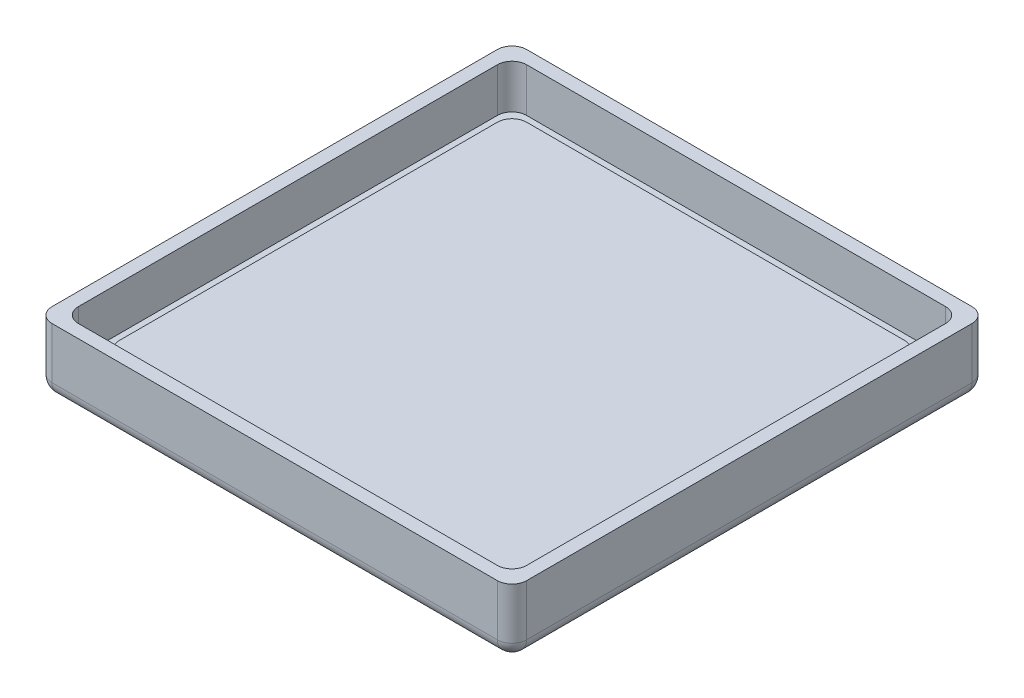
ISO-10303-21;
HEADER;
FILE_DESCRIPTION(('STEP AP214'),'2;1');
FILE_NAME('part.step','',(''),(''),'','','');
FILE_SCHEMA(('AUTOMOTIVE_DESIGN { 1 0 10303 214 1 1 1 1 }'));
ENDSEC;
DATA;
#1=APPLICATION_CONTEXT('core data for automotive mechanical design processes');
#2=APPLICATION_PROTOCOL_DEFINITION('international standard','automotive_design',2000,#1);
#3=PRODUCT_CONTEXT('',#1,'mechanical');
#4=PRODUCT('Part','Part','',(#3));
#5=PRODUCT_RELATED_PRODUCT_CATEGORY('part','',(#4));
#6=PRODUCT_DEFINITION_FORMATION('','',#4);
#7=PRODUCT_DEFINITION_CONTEXT('part definition',#1,'design');
#8=PRODUCT_DEFINITION('design','',#6,#7);
#9=PRODUCT_DEFINITION_SHAPE('','',#8);
#10=(LENGTH_UNIT() NAMED_UNIT(*) SI_UNIT(.MILLI.,.METRE.));
#11=(NAMED_UNIT(*) PLANE_ANGLE_UNIT() SI_UNIT($,.RADIAN.));
#12=(NAMED_UNIT(*) SI_UNIT($,.STERADIAN.) SOLID_ANGLE_UNIT());
#13=UNCERTAINTY_MEASURE_WITH_UNIT(LENGTH_MEASURE(1.E-05),#10,'distance_accuracy_value','');
#14=(GEOMETRIC_REPRESENTATION_CONTEXT(3) GLOBAL_UNCERTAINTY_ASSIGNED_CONTEXT((#13)) GLOBAL_UNIT_ASSIGNED_CONTEXT((#10,
#11,#12)) REPRESENTATION_CONTEXT('',''));
#15=CARTESIAN_POINT('',(0.,0.,0.));
#16=DIRECTION('',(0.,0.,1.));
#17=DIRECTION('',(1.,0.,0.));
#18=AXIS2_PLACEMENT_3D('',#15,#16,#17);
#19=CARTESIAN_POINT('',(0.,7.5,0.));
#20=DIRECTION('',(0.,1.,0.));
#21=DIRECTION('',(0.,0.,1.));
#22=AXIS2_PLACEMENT_3D('',#19,#20,#21);
#23=PLANE('',#22);
#24=CARTESIAN_POINT('',(9.5,7.5,-152.5));
#25=DIRECTION('',(0.,1.,0.));
#26=DIRECTION('',(0.,0.,1.));
#27=AXIS2_PLACEMENT_3D('',#24,#25,#26);
#28=CIRCLE('',#27,5.);
#29=CARTESIAN_POINT('',(9.5,7.5,-157.5));
#30=VERTEX_POINT('',#29);
#31=CARTESIAN_POINT('',(4.5,7.5,-152.5));
#32=VERTEX_POINT('',#31);
#33=EDGE_CURVE('E307',#30,#32,#28,.T.);
#34=ORIENTED_EDGE('',*,*,#33,.T.);
#35=DIRECTION('',(0.,0.,1.));
#36=VECTOR('',#35,1.);
#37=CARTESIAN_POINT('',(4.50000000000002,7.5,0.));
#38=LINE('',#37,#36);
#39=CARTESIAN_POINT('',(4.50000000000002,7.5,-9.50000000000004));
#40=VERTEX_POINT('',#39);
#41=EDGE_CURVE('E325',#32,#40,#38,.T.);
#42=ORIENTED_EDGE('',*,*,#41,.T.);
#43=CARTESIAN_POINT('',(9.50000000000002,7.5,-9.5));
#44=DIRECTION('',(0.,1.,0.));
#45=DIRECTION('',(0.,0.,1.));
#46=AXIS2_PLACEMENT_3D('',#43,#44,#45);
#47=CIRCLE('',#46,5.);
#48=CARTESIAN_POINT('',(9.50000000000002,7.5,-4.5));
#49=VERTEX_POINT('',#48);
#50=EDGE_CURVE('E327',#40,#49,#47,.T.);
#51=ORIENTED_EDGE('',*,*,#50,.T.);
#52=DIRECTION('',(1.,0.,0.));
#53=VECTOR('',#52,1.);
#54=CARTESIAN_POINT('',(0.,7.5,-4.5));
#55=LINE('',#54,#53);
#56=CARTESIAN_POINT('',(152.5,7.5,-4.5));
#57=VERTEX_POINT('',#56);
#58=EDGE_CURVE('E376',#49,#57,#55,.T.);
#59=ORIENTED_EDGE('',*,*,#58,.T.);
#60=CARTESIAN_POINT('',(152.5,7.5,-9.5));
#61=DIRECTION('',(0.,1.,0.));
#62=DIRECTION('',(0.,0.,1.));
#63=AXIS2_PLACEMENT_3D('',#60,#61,#62);
#64=CIRCLE('',#63,4.99999999999999);
#65=CARTESIAN_POINT('',(157.5,7.5,-9.5));
#66=VERTEX_POINT('',#65);
#67=EDGE_CURVE('E374',#57,#66,#64,.T.);
#68=ORIENTED_EDGE('',*,*,#67,.T.);
#69=DIRECTION('',(0.,0.,1.));
#70=VECTOR('',#69,1.);
#71=CARTESIAN_POINT('',(157.5,7.5,0.));
#72=LINE('',#71,#70);
#73=CARTESIAN_POINT('',(157.5,7.5,-152.5));
#74=VERTEX_POINT('',#73);
#75=EDGE_CURVE('E371',#74,#66,#72,.T.);
#76=ORIENTED_EDGE('',*,*,#75,.F.);
#77=CARTESIAN_POINT('',(152.5,7.5,-152.5));
#78=DIRECTION('',(0.,1.,0.));
#79=DIRECTION('',(0.,0.,1.));
#80=AXIS2_PLACEMENT_3D('',#77,#78,#79);
#81=CIRCLE('',#80,5.);
#82=CARTESIAN_POINT('',(152.5,7.5,-157.5));
#83=VERTEX_POINT('',#82);
#84=EDGE_CURVE('E150',#83,#74,#81,.F.);
#85=ORIENTED_EDGE('',*,*,#84,.F.);
#86=DIRECTION('',(1.,0.,0.));
#87=VECTOR('',#86,1.);
#88=CARTESIAN_POINT('',(0.,7.5,-157.5));
#89=LINE('',#88,#87);
#90=EDGE_CURVE('E145',#30,#83,#89,.T.);
#91=ORIENTED_EDGE('',*,*,#90,.F.);
#92=EDGE_LOOP('',(#34,#42,#51,#59,#68,#76,#85,#91));
#93=FACE_BOUND('',#92,.T.);
#94=DIRECTION('',(0.,0.,1.));
#95=VECTOR('',#94,1.);
#96=CARTESIAN_POINT('',(11.5,7.5,-150.5));
#97=LINE('',#96,#95);
#98=CARTESIAN_POINT('',(11.5,7.5,-145.5));
#99=VERTEX_POINT('',#98);
#100=CARTESIAN_POINT('',(11.5,7.5,-16.5));
#101=VERTEX_POINT('',#100);
#102=EDGE_CURVE('E410',#99,#101,#97,.T.);
#103=ORIENTED_EDGE('',*,*,#102,.F.);
#104=CARTESIAN_POINT('',(16.5,7.5,-145.5));
#105=DIRECTION('',(0.,1.,0.));
#106=DIRECTION('',(0.,0.,1.));
#107=AXIS2_PLACEMENT_3D('',#104,#105,#106);
#108=CIRCLE('',#107,5.);
#109=CARTESIAN_POINT('',(16.5,7.5,-150.5));
#110=VERTEX_POINT('',#109);
#111=EDGE_CURVE('E137',#99,#110,#108,.F.);
#112=ORIENTED_EDGE('',*,*,#111,.T.);
#113=DIRECTION('',(-1.,0.,0.));
#114=VECTOR('',#113,1.);
#115=CARTESIAN_POINT('',(11.5,7.5,-150.5));
#116=LINE('',#115,#114);
#117=CARTESIAN_POINT('',(145.5,7.5,-150.5));
#118=VERTEX_POINT('',#117);
#119=EDGE_CURVE('E400',#118,#110,#116,.T.);
#120=ORIENTED_EDGE('',*,*,#119,.F.);
#121=CARTESIAN_POINT('',(145.5,7.5,-145.5));
#122=DIRECTION('',(0.,1.,0.));
#123=DIRECTION('',(0.,0.,1.));
#124=AXIS2_PLACEMENT_3D('',#121,#122,#123);
#125=CIRCLE('',#124,5.);
#126=CARTESIAN_POINT('',(150.5,7.5,-145.5));
#127=VERTEX_POINT('',#126);
#128=EDGE_CURVE('E482',#118,#127,#125,.F.);
#129=ORIENTED_EDGE('',*,*,#128,.T.);
#130=DIRECTION('',(0.,0.,-1.));
#131=VECTOR('',#130,1.);
#132=CARTESIAN_POINT('',(150.5,7.5,-150.5));
#133=LINE('',#132,#131);
#134=CARTESIAN_POINT('',(150.5,7.5,-16.5));
#135=VERTEX_POINT('',#134);
#136=EDGE_CURVE('E416',#135,#127,#133,.T.);
#137=ORIENTED_EDGE('',*,*,#136,.F.);
#138=CARTESIAN_POINT('',(145.5,7.5,-16.5));
#139=DIRECTION('',(0.,1.,0.));
#140=DIRECTION('',(0.,0.,1.));
#141=AXIS2_PLACEMENT_3D('',#138,#139,#140);
#142=CIRCLE('',#141,5.);
#143=CARTESIAN_POINT('',(145.5,7.5,-11.5));
#144=VERTEX_POINT('',#143);
#145=EDGE_CURVE('E484',#135,#144,#142,.F.);
#146=ORIENTED_EDGE('',*,*,#145,.T.);
#147=DIRECTION('',(1.,0.,0.));
#148=VECTOR('',#147,1.);
#149=CARTESIAN_POINT('',(11.5,7.5,-11.5));
#150=LINE('',#149,#148);
#151=CARTESIAN_POINT('',(16.5,7.5,-11.5));
#152=VERTEX_POINT('',#151);
#153=EDGE_CURVE('E413',#152,#144,#150,.T.);
#154=ORIENTED_EDGE('',*,*,#153,.F.);
#155=CARTESIAN_POINT('',(16.5,7.5,-16.5));
#156=DIRECTION('',(0.,1.,0.));
#157=DIRECTION('',(0.,0.,1.));
#158=AXIS2_PLACEMENT_3D('',#155,#156,#157);
#159=CIRCLE('',#158,5.);
#160=EDGE_CURVE('E12',#152,#101,#159,.F.);
#161=ORIENTED_EDGE('',*,*,#160,.T.);
#162=EDGE_LOOP('',(#103,#112,#120,#129,#137,#146,#154,#161));
#163=FACE_BOUND('',#162,.T.);
#164=ADVANCED_FACE('F128',(#93,#163),#23,.T.);
#165=CARTESIAN_POINT('',(11.5,12.5,-150.5));
#166=DIRECTION('',(1.,0.,0.));
#167=DIRECTION('',(0.,0.,-1.));
#168=AXIS2_PLACEMENT_3D('',#165,#166,#167);
#169=PLANE('',#168);
#170=DIRECTION('',(0.,0.,1.));
#171=VECTOR('',#170,1.);
#172=CARTESIAN_POINT('',(11.5,12.5,-150.5));
#173=LINE('',#172,#171);
#174=CARTESIAN_POINT('',(11.5,12.5,-145.5));
#175=VERTEX_POINT('',#174);
#176=CARTESIAN_POINT('',(11.5,12.5,-16.5));
#177=VERTEX_POINT('',#176);
#178=EDGE_CURVE('E396',#175,#177,#173,.T.);
#179=ORIENTED_EDGE('',*,*,#178,.F.);
#180=DIRECTION('',(0.,-1.,0.));
#181=VECTOR('',#180,1.);
#182=CARTESIAN_POINT('',(11.5,12.5,-145.5));
#183=LINE('',#182,#181);
#184=EDGE_CURVE('E479',#175,#99,#183,.T.);
#185=ORIENTED_EDGE('',*,*,#184,.T.);
#186=ORIENTED_EDGE('',*,*,#102,.T.);
#187=DIRECTION('',(0.,-1.,0.));
#188=VECTOR('',#187,1.);
#189=CARTESIAN_POINT('',(11.5,12.5,-16.5));
#190=LINE('',#189,#188);
#191=EDGE_CURVE('E477',#101,#177,#190,.F.);
#192=ORIENTED_EDGE('',*,*,#191,.T.);
#193=EDGE_LOOP('',(#179,#185,#186,#192));
#194=FACE_BOUND('',#193,.T.);
#195=ADVANCED_FACE('F585',(#194),#169,.F.);
#196=CARTESIAN_POINT('',(11.5,12.5,-11.5));
#197=DIRECTION('',(0.,0.,-1.));
#198=DIRECTION('',(-1.,0.,0.));
#199=AXIS2_PLACEMENT_3D('',#196,#197,#198);
#200=PLANE('',#199);
#201=ORIENTED_EDGE('',*,*,#153,.T.);
#202=DIRECTION('',(0.,-1.,0.));
#203=VECTOR('',#202,1.);
#204=CARTESIAN_POINT('',(145.5,12.5,-11.5));
#205=LINE('',#204,#203);
#206=CARTESIAN_POINT('',(145.5,12.5,-11.5));
#207=VERTEX_POINT('',#206);
#208=EDGE_CURVE('E441',#144,#207,#205,.F.);
#209=ORIENTED_EDGE('',*,*,#208,.T.);
#210=DIRECTION('',(1.,0.,0.));
#211=VECTOR('',#210,1.);
#212=CARTESIAN_POINT('',(11.5,12.5,-11.5));
#213=LINE('',#212,#211);
#214=CARTESIAN_POINT('',(16.5,12.5,-11.5));
#215=VERTEX_POINT('',#214);
#216=EDGE_CURVE('E399',#215,#207,#213,.T.);
#217=ORIENTED_EDGE('',*,*,#216,.F.);
#218=DIRECTION('',(0.,-1.,0.));
#219=VECTOR('',#218,1.);
#220=CARTESIAN_POINT('',(16.5,12.5,-11.5));
#221=LINE('',#220,#219);
#222=EDGE_CURVE('E438',#215,#152,#221,.T.);
#223=ORIENTED_EDGE('',*,*,#222,.T.);
#224=EDGE_LOOP('',(#201,#209,#217,#223));
#225=FACE_BOUND('',#224,.T.);
#226=ADVANCED_FACE('F590',(#225),#200,.F.);
#227=CARTESIAN_POINT('',(150.5,12.5,-150.5));
#228=DIRECTION('',(-1.,0.,0.));
#229=DIRECTION('',(0.,0.,1.));
#230=AXIS2_PLACEMENT_3D('',#227,#228,#229);
#231=PLANE('',#230);
#232=ORIENTED_EDGE('',*,*,#136,.T.);
#233=DIRECTION('',(0.,-1.,0.));
#234=VECTOR('',#233,1.);
#235=CARTESIAN_POINT('',(150.5,12.5,-145.5));
#236=LINE('',#235,#234);
#237=CARTESIAN_POINT('',(150.5,12.5,-145.5));
#238=VERTEX_POINT('',#237);
#239=EDGE_CURVE('E428',#127,#238,#236,.F.);
#240=ORIENTED_EDGE('',*,*,#239,.T.);
#241=DIRECTION('',(0.,0.,-1.));
#242=VECTOR('',#241,1.);
#243=CARTESIAN_POINT('',(150.5,12.5,-150.5));
#244=LINE('',#243,#242);
#245=CARTESIAN_POINT('',(150.5,12.5,-16.5));
#246=VERTEX_POINT('',#245);
#247=EDGE_CURVE('E403',#246,#238,#244,.T.);
#248=ORIENTED_EDGE('',*,*,#247,.F.);
#249=DIRECTION('',(0.,-1.,0.));
#250=VECTOR('',#249,1.);
#251=CARTESIAN_POINT('',(150.5,12.5,-16.5));
#252=LINE('',#251,#250);
#253=EDGE_CURVE('E425',#246,#135,#252,.T.);
#254=ORIENTED_EDGE('',*,*,#253,.T.);
#255=EDGE_LOOP('',(#232,#240,#248,#254));
#256=FACE_BOUND('',#255,.T.);
#257=ADVANCED_FACE('F886',(#256),#231,.F.);
#258=CARTESIAN_POINT('',(11.5,12.5,-150.5));
#259=DIRECTION('',(0.,0.,1.));
#260=DIRECTION('',(1.,0.,0.));
#261=AXIS2_PLACEMENT_3D('',#258,#259,#260);
#262=PLANE('',#261);
#263=DIRECTION('',(-1.,0.,0.));
#264=VECTOR('',#263,1.);
#265=CARTESIAN_POINT('',(11.5,12.5,-150.5));
#266=LINE('',#265,#264);
#267=CARTESIAN_POINT('',(145.5,12.5,-150.5));
#268=VERTEX_POINT('',#267);
#269=CARTESIAN_POINT('',(16.5,12.5,-150.5));
#270=VERTEX_POINT('',#269);
#271=EDGE_CURVE('E406',#268,#270,#266,.T.);
#272=ORIENTED_EDGE('',*,*,#271,.F.);
#273=DIRECTION('',(0.,-1.,0.));
#274=VECTOR('',#273,1.);
#275=CARTESIAN_POINT('',(145.5,12.5,-150.5));
#276=LINE('',#275,#274);
#277=EDGE_CURVE('E422',#268,#118,#276,.T.);
#278=ORIENTED_EDGE('',*,*,#277,.T.);
#279=ORIENTED_EDGE('',*,*,#119,.T.);
#280=DIRECTION('',(0.,-1.,0.));
#281=VECTOR('',#280,1.);
#282=CARTESIAN_POINT('',(16.5,12.5,-150.5));
#283=LINE('',#282,#281);
#284=EDGE_CURVE('E409',#110,#270,#283,.F.);
#285=ORIENTED_EDGE('',*,*,#284,.T.);
#286=EDGE_LOOP('',(#272,#278,#279,#285));
#287=FACE_BOUND('',#286,.T.);
#288=ADVANCED_FACE('F875',(#287),#262,.F.);
#289=CARTESIAN_POINT('',(0.,12.5,0.));
#290=DIRECTION('',(0.,1.,0.));
#291=DIRECTION('',(0.,0.,1.));
#292=AXIS2_PLACEMENT_3D('',#289,#290,#291);
#293=PLANE('',#292);
#294=ORIENTED_EDGE('',*,*,#247,.T.);
#295=CARTESIAN_POINT('',(145.5,12.5,-145.5));
#296=DIRECTION('',(0.,1.,0.));
#297=DIRECTION('',(0.,0.,1.));
#298=AXIS2_PLACEMENT_3D('',#295,#296,#297);
#299=CIRCLE('',#298,5.);
#300=EDGE_CURVE('E436',#238,#268,#299,.T.);
#301=ORIENTED_EDGE('',*,*,#300,.T.);
#302=ORIENTED_EDGE('',*,*,#271,.T.);
#303=CARTESIAN_POINT('',(16.5,12.5,-145.5));
#304=DIRECTION('',(0.,1.,0.));
#305=DIRECTION('',(0.,0.,1.));
#306=AXIS2_PLACEMENT_3D('',#303,#304,#305);
#307=CIRCLE('',#306,5.);
#308=EDGE_CURVE('E432',#270,#175,#307,.T.);
#309=ORIENTED_EDGE('',*,*,#308,.T.);
#310=ORIENTED_EDGE('',*,*,#178,.T.);
#311=CARTESIAN_POINT('',(16.5,12.5,-16.5));
#312=DIRECTION('',(0.,1.,0.));
#313=DIRECTION('',(0.,0.,1.));
#314=AXIS2_PLACEMENT_3D('',#311,#312,#313);
#315=CIRCLE('',#314,5.);
#316=EDGE_CURVE('E430',#177,#215,#315,.T.);
#317=ORIENTED_EDGE('',*,*,#316,.T.);
#318=ORIENTED_EDGE('',*,*,#216,.T.);
#319=CARTESIAN_POINT('',(145.5,12.5,-16.5));
#320=DIRECTION('',(0.,1.,0.));
#321=DIRECTION('',(0.,0.,1.));
#322=AXIS2_PLACEMENT_3D('',#319,#320,#321);
#323=CIRCLE('',#322,5.);
#324=EDGE_CURVE('E434',#207,#246,#323,.T.);
#325=ORIENTED_EDGE('',*,*,#324,.T.);
#326=EDGE_LOOP('',(#294,#301,#302,#309,#310,#317,#318,#325));
#327=FACE_BOUND('',#326,.T.);
#328=ADVANCED_FACE('F865',(#327),#293,.T.);
#329=CARTESIAN_POINT('',(145.5,12.5,-145.5));
#330=DIRECTION('',(0.,-1.,0.));
#331=DIRECTION('',(0.,0.,-1.));
#332=AXIS2_PLACEMENT_3D('',#329,#330,#331);
#333=CYLINDRICAL_SURFACE('',#332,5.);
#334=ORIENTED_EDGE('',*,*,#300,.F.);
#335=ORIENTED_EDGE('',*,*,#239,.F.);
#336=ORIENTED_EDGE('',*,*,#128,.F.);
#337=ORIENTED_EDGE('',*,*,#277,.F.);
#338=EDGE_LOOP('',(#334,#335,#336,#337));
#339=FACE_BOUND('',#338,.T.);
#340=ADVANCED_FACE('F854',(#339),#333,.T.);
#341=CARTESIAN_POINT('',(145.5,12.5,-16.5));
#342=DIRECTION('',(0.,-1.,0.));
#343=DIRECTION('',(0.,0.,-1.));
#344=AXIS2_PLACEMENT_3D('',#341,#342,#343);
#345=CYLINDRICAL_SURFACE('',#344,5.);
#346=ORIENTED_EDGE('',*,*,#324,.F.);
#347=ORIENTED_EDGE('',*,*,#208,.F.);
#348=ORIENTED_EDGE('',*,*,#145,.F.);
#349=ORIENTED_EDGE('',*,*,#253,.F.);
#350=EDGE_LOOP('',(#346,#347,#348,#349));
#351=FACE_BOUND('',#350,.T.);
#352=ADVANCED_FACE('F767',(#351),#345,.T.);
#353=CARTESIAN_POINT('',(16.5,12.5,-145.5));
#354=DIRECTION('',(0.,-1.,0.));
#355=DIRECTION('',(0.,0.,-1.));
#356=AXIS2_PLACEMENT_3D('',#353,#354,#355);
#357=CYLINDRICAL_SURFACE('',#356,5.);
#358=ORIENTED_EDGE('',*,*,#308,.F.);
#359=ORIENTED_EDGE('',*,*,#284,.F.);
#360=ORIENTED_EDGE('',*,*,#111,.F.);
#361=ORIENTED_EDGE('',*,*,#184,.F.);
#362=EDGE_LOOP('',(#358,#359,#360,#361));
#363=FACE_BOUND('',#362,.T.);
#364=ADVANCED_FACE('F757',(#363),#357,.T.);
#365=CARTESIAN_POINT('',(16.5,12.5,-16.5));
#366=DIRECTION('',(0.,-1.,0.));
#367=DIRECTION('',(0.,0.,-1.));
#368=AXIS2_PLACEMENT_3D('',#365,#366,#367);
#369=CYLINDRICAL_SURFACE('',#368,5.);
#370=ORIENTED_EDGE('',*,*,#316,.F.);
#371=ORIENTED_EDGE('',*,*,#191,.F.);
#372=ORIENTED_EDGE('',*,*,#160,.F.);
#373=ORIENTED_EDGE('',*,*,#222,.F.);
#374=EDGE_LOOP('',(#370,#371,#372,#373));
#375=FACE_BOUND('',#374,.T.);
#376=ADVANCED_FACE('F130',(#375),#369,.T.);
#377=CARTESIAN_POINT('',(9.5,22.5,-152.5));
#378=DIRECTION('',(0.,-1.,0.));
#379=DIRECTION('',(0.,0.,-1.));
#380=AXIS2_PLACEMENT_3D('',#377,#378,#379);
#381=CYLINDRICAL_SURFACE('',#380,5.);
#382=ORIENTED_EDGE('',*,*,#33,.F.);
#383=DIRECTION('',(0.,-1.,0.));
#384=VECTOR('',#383,1.);
#385=CARTESIAN_POINT('',(9.5,22.5,-157.5));
#386=LINE('',#385,#384);
#387=CARTESIAN_POINT('',(9.5,22.5,-157.5));
#388=VERTEX_POINT('',#387);
#389=EDGE_CURVE('E300',#388,#30,#386,.T.);
#390=ORIENTED_EDGE('',*,*,#389,.F.);
#391=CARTESIAN_POINT('',(9.5,22.5,-152.5));
#392=DIRECTION('',(0.,1.,0.));
#393=DIRECTION('',(0.,0.,1.));
#394=AXIS2_PLACEMENT_3D('',#391,#392,#393);
#395=CIRCLE('',#394,5.);
#396=CARTESIAN_POINT('',(4.5,22.5,-152.5));
#397=VERTEX_POINT('',#396);
#398=EDGE_CURVE('E305',#388,#397,#395,.T.);
#399=ORIENTED_EDGE('',*,*,#398,.T.);
#400=DIRECTION('',(0.,-1.,0.));
#401=VECTOR('',#400,1.);
#402=CARTESIAN_POINT('',(4.5,22.5,-152.5));
#403=LINE('',#402,#401);
#404=EDGE_CURVE('E367',#397,#32,#403,.T.);
#405=ORIENTED_EDGE('',*,*,#404,.T.);
#406=EDGE_LOOP('',(#382,#390,#399,#405));
#407=FACE_BOUND('',#406,.T.);
#408=ADVANCED_FACE('F302',(#407),#381,.F.);
#409=CARTESIAN_POINT('',(0.,22.5,-157.5));
#410=DIRECTION('',(0.,0.,-1.));
#411=DIRECTION('',(-1.,0.,0.));
#412=AXIS2_PLACEMENT_3D('',#409,#410,#411);
#413=PLANE('',#412);
#414=ORIENTED_EDGE('',*,*,#90,.T.);
#415=DIRECTION('',(0.,-1.,0.));
#416=VECTOR('',#415,1.);
#417=CARTESIAN_POINT('',(152.5,22.5,-157.5));
#418=LINE('',#417,#416);
#419=CARTESIAN_POINT('',(152.5,22.5,-157.5));
#420=VERTEX_POINT('',#419);
#421=EDGE_CURVE('E310',#420,#83,#418,.T.);
#422=ORIENTED_EDGE('',*,*,#421,.F.);
#423=DIRECTION('',(1.,0.,0.));
#424=VECTOR('',#423,1.);
#425=CARTESIAN_POINT('',(0.,22.5,-157.5));
#426=LINE('',#425,#424);
#427=EDGE_CURVE('E313',#388,#420,#426,.T.);
#428=ORIENTED_EDGE('',*,*,#427,.F.);
#429=ORIENTED_EDGE('',*,*,#389,.T.);
#430=EDGE_LOOP('',(#414,#422,#428,#429));
#431=FACE_BOUND('',#430,.T.);
#432=ADVANCED_FACE('F314',(#431),#413,.F.);
#433=CARTESIAN_POINT('',(152.5,22.5,-152.5));
#434=DIRECTION('',(0.,-1.,0.));
#435=DIRECTION('',(0.,0.,-1.));
#436=AXIS2_PLACEMENT_3D('',#433,#434,#435);
#437=CYLINDRICAL_SURFACE('',#436,5.);
#438=ORIENTED_EDGE('',*,*,#84,.T.);
#439=DIRECTION('',(0.,-1.,0.));
#440=VECTOR('',#439,1.);
#441=CARTESIAN_POINT('',(157.5,22.5,-152.5));
#442=LINE('',#441,#440);
#443=CARTESIAN_POINT('',(157.5,22.5,-152.5));
#444=VERTEX_POINT('',#443);
#445=EDGE_CURVE('E392',#444,#74,#442,.T.);
#446=ORIENTED_EDGE('',*,*,#445,.F.);
#447=CARTESIAN_POINT('',(152.5,22.5,-152.5));
#448=DIRECTION('',(0.,1.,0.));
#449=DIRECTION('',(0.,0.,1.));
#450=AXIS2_PLACEMENT_3D('',#447,#448,#449);
#451=CIRCLE('',#450,5.);
#452=EDGE_CURVE('E318',#420,#444,#451,.F.);
#453=ORIENTED_EDGE('',*,*,#452,.F.);
#454=ORIENTED_EDGE('',*,*,#421,.T.);
#455=EDGE_LOOP('',(#438,#446,#453,#454));
#456=FACE_BOUND('',#455,.T.);
#457=ADVANCED_FACE('F712',(#456),#437,.F.);
#458=CARTESIAN_POINT('',(157.5,22.5,0.));
#459=DIRECTION('',(1.,0.,0.));
#460=DIRECTION('',(0.,0.,-1.));
#461=AXIS2_PLACEMENT_3D('',#458,#459,#460);
#462=PLANE('',#461);
#463=ORIENTED_EDGE('',*,*,#75,.T.);
#464=DIRECTION('',(0.,-1.,0.));
#465=VECTOR('',#464,1.);
#466=CARTESIAN_POINT('',(157.5,22.5,-9.5));
#467=LINE('',#466,#465);
#468=CARTESIAN_POINT('',(157.5,22.5,-9.5));
#469=VERTEX_POINT('',#468);
#470=EDGE_CURVE('E389',#469,#66,#467,.T.);
#471=ORIENTED_EDGE('',*,*,#470,.F.);
#472=DIRECTION('',(0.,0.,1.));
#473=VECTOR('',#472,1.);
#474=CARTESIAN_POINT('',(157.5,22.5,0.));
#475=LINE('',#474,#473);
#476=EDGE_CURVE('E331',#444,#469,#475,.T.);
#477=ORIENTED_EDGE('',*,*,#476,.F.);
#478=ORIENTED_EDGE('',*,*,#445,.T.);
#479=EDGE_LOOP('',(#463,#471,#477,#478));
#480=FACE_BOUND('',#479,.T.);
#481=ADVANCED_FACE('F701',(#480),#462,.F.);
#482=CARTESIAN_POINT('',(152.5,22.5,-9.5));
#483=DIRECTION('',(0.,-1.,0.));
#484=DIRECTION('',(0.,0.,-1.));
#485=AXIS2_PLACEMENT_3D('',#482,#483,#484);
#486=CYLINDRICAL_SURFACE('',#485,4.99999999999999);
#487=ORIENTED_EDGE('',*,*,#67,.F.);
#488=DIRECTION('',(0.,-1.,0.));
#489=VECTOR('',#488,1.);
#490=CARTESIAN_POINT('',(152.5,22.5,-4.5));
#491=LINE('',#490,#489);
#492=CARTESIAN_POINT('',(152.5,22.5,-4.5));
#493=VERTEX_POINT('',#492);
#494=EDGE_CURVE('E386',#493,#57,#491,.T.);
#495=ORIENTED_EDGE('',*,*,#494,.F.);
#496=CARTESIAN_POINT('',(152.5,22.5,-9.5));
#497=DIRECTION('',(0.,1.,0.));
#498=DIRECTION('',(0.,0.,1.));
#499=AXIS2_PLACEMENT_3D('',#496,#497,#498);
#500=CIRCLE('',#499,4.99999999999999);
#501=EDGE_CURVE('E333',#493,#469,#500,.T.);
#502=ORIENTED_EDGE('',*,*,#501,.T.);
#503=ORIENTED_EDGE('',*,*,#470,.T.);
#504=EDGE_LOOP('',(#487,#495,#502,#503));
#505=FACE_BOUND('',#504,.T.);
#506=ADVANCED_FACE('F690',(#505),#486,.F.);
#507=CARTESIAN_POINT('',(0.,22.5,-4.5));
#508=DIRECTION('',(0.,0.,-1.));
#509=DIRECTION('',(-1.,0.,0.));
#510=AXIS2_PLACEMENT_3D('',#507,#508,#509);
#511=PLANE('',#510);
#512=ORIENTED_EDGE('',*,*,#58,.F.);
#513=DIRECTION('',(0.,-1.,0.));
#514=VECTOR('',#513,1.);
#515=CARTESIAN_POINT('',(9.50000000000005,22.5,-4.5));
#516=LINE('',#515,#514);
#517=CARTESIAN_POINT('',(9.50000000000005,22.5,-4.5));
#518=VERTEX_POINT('',#517);
#519=EDGE_CURVE('E383',#518,#49,#516,.T.);
#520=ORIENTED_EDGE('',*,*,#519,.F.);
#521=DIRECTION('',(1.,0.,0.));
#522=VECTOR('',#521,1.);
#523=CARTESIAN_POINT('',(0.,22.5,-4.5));
#524=LINE('',#523,#522);
#525=EDGE_CURVE('E336',#518,#493,#524,.T.);
#526=ORIENTED_EDGE('',*,*,#525,.T.);
#527=ORIENTED_EDGE('',*,*,#494,.T.);
#528=EDGE_LOOP('',(#512,#520,#526,#527));
#529=FACE_BOUND('',#528,.T.);
#530=ADVANCED_FACE('F679',(#529),#511,.T.);
#531=CARTESIAN_POINT('',(9.50000000000002,22.5,-9.5));
#532=DIRECTION('',(0.,-1.,0.));
#533=DIRECTION('',(0.,0.,-1.));
#534=AXIS2_PLACEMENT_3D('',#531,#532,#533);
#535=CYLINDRICAL_SURFACE('',#534,5.);
#536=ORIENTED_EDGE('',*,*,#50,.F.);
#537=DIRECTION('',(0.,-1.,0.));
#538=VECTOR('',#537,1.);
#539=CARTESIAN_POINT('',(4.50000000000002,22.5,-9.50000000000004));
#540=LINE('',#539,#538);
#541=CARTESIAN_POINT('',(4.50000000000002,22.5,-9.50000000000004));
#542=VERTEX_POINT('',#541);
#543=EDGE_CURVE('E380',#542,#40,#540,.T.);
#544=ORIENTED_EDGE('',*,*,#543,.F.);
#545=CARTESIAN_POINT('',(9.50000000000002,22.5,-9.5));
#546=DIRECTION('',(0.,1.,0.));
#547=DIRECTION('',(0.,0.,1.));
#548=AXIS2_PLACEMENT_3D('',#545,#546,#547);
#549=CIRCLE('',#548,5.);
#550=EDGE_CURVE('E339',#542,#518,#549,.T.);
#551=ORIENTED_EDGE('',*,*,#550,.T.);
#552=ORIENTED_EDGE('',*,*,#519,.T.);
#553=EDGE_LOOP('',(#536,#544,#551,#552));
#554=FACE_BOUND('',#553,.T.);
#555=ADVANCED_FACE('F668',(#554),#535,.F.);
#556=CARTESIAN_POINT('',(4.50000000000002,22.5,0.));
#557=DIRECTION('',(1.,0.,0.));
#558=DIRECTION('',(0.,0.,-1.));
#559=AXIS2_PLACEMENT_3D('',#556,#557,#558);
#560=PLANE('',#559);
#561=ORIENTED_EDGE('',*,*,#41,.F.);
#562=ORIENTED_EDGE('',*,*,#404,.F.);
#563=DIRECTION('',(0.,0.,1.));
#564=VECTOR('',#563,1.);
#565=CARTESIAN_POINT('',(4.50000000000002,22.5,0.));
#566=LINE('',#565,#564);
#567=EDGE_CURVE('E324',#397,#542,#566,.T.);
#568=ORIENTED_EDGE('',*,*,#567,.T.);
#569=ORIENTED_EDGE('',*,*,#543,.T.);
#570=EDGE_LOOP('',(#561,#562,#568,#569));
#571=FACE_BOUND('',#570,.T.);
#572=ADVANCED_FACE('F658',(#571),#560,.T.);
#573=CARTESIAN_POINT('',(0.,22.5,0.));
#574=DIRECTION('',(0.,1.,0.));
#575=DIRECTION('',(0.,0.,1.));
#576=AXIS2_PLACEMENT_3D('',#573,#574,#575);
#577=PLANE('',#576);
#578=ORIENTED_EDGE('',*,*,#398,.F.);
#579=ORIENTED_EDGE('',*,*,#427,.T.);
#580=ORIENTED_EDGE('',*,*,#452,.T.);
#581=ORIENTED_EDGE('',*,*,#476,.T.);
#582=ORIENTED_EDGE('',*,*,#501,.F.);
#583=ORIENTED_EDGE('',*,*,#525,.F.);
#584=ORIENTED_EDGE('',*,*,#550,.F.);
#585=ORIENTED_EDGE('',*,*,#567,.F.);
#586=EDGE_LOOP('',(#578,#579,#580,#581,#582,#583,#584,#585));
#587=FACE_BOUND('',#586,.T.);
#588=CARTESIAN_POINT('',(5.,22.5,-157.));
#589=DIRECTION('',(0.,1.,0.));
#590=DIRECTION('',(0.,0.,1.));
#591=AXIS2_PLACEMENT_3D('',#588,#589,#590);
#592=CIRCLE('',#591,5.);
#593=CARTESIAN_POINT('',(5.,22.5,-162.));
#594=VERTEX_POINT('',#593);
#595=CARTESIAN_POINT('',(0.,22.5,-157.));
#596=VERTEX_POINT('',#595);
#597=EDGE_CURVE('E343',#594,#596,#592,.T.);
#598=ORIENTED_EDGE('',*,*,#597,.T.);
#599=DIRECTION('',(0.,0.,1.));
#600=VECTOR('',#599,1.);
#601=CARTESIAN_POINT('',(0.,22.5,0.));
#602=LINE('',#601,#600);
#603=CARTESIAN_POINT('',(0.,22.5,-5.));
#604=VERTEX_POINT('',#603);
#605=EDGE_CURVE('E346',#596,#604,#602,.T.);
#606=ORIENTED_EDGE('',*,*,#605,.T.);
#607=CARTESIAN_POINT('',(5.,22.5,-5.));
#608=DIRECTION('',(0.,1.,0.));
#609=DIRECTION('',(0.,0.,1.));
#610=AXIS2_PLACEMENT_3D('',#607,#608,#609);
#611=CIRCLE('',#610,5.);
#612=CARTESIAN_POINT('',(5.,22.5,0.));
#613=VERTEX_POINT('',#612);
#614=EDGE_CURVE('E349',#604,#613,#611,.T.);
#615=ORIENTED_EDGE('',*,*,#614,.T.);
#616=DIRECTION('',(1.,0.,0.));
#617=VECTOR('',#616,1.);
#618=CARTESIAN_POINT('',(0.,22.5,0.));
#619=LINE('',#618,#617);
#620=CARTESIAN_POINT('',(157.,22.5,0.));
#621=VERTEX_POINT('',#620);
#622=EDGE_CURVE('E352',#613,#621,#619,.T.);
#623=ORIENTED_EDGE('',*,*,#622,.T.);
#624=CARTESIAN_POINT('',(157.,22.5,-5.));
#625=DIRECTION('',(0.,1.,0.));
#626=DIRECTION('',(0.,0.,1.));
#627=AXIS2_PLACEMENT_3D('',#624,#625,#626);
#628=CIRCLE('',#627,5.);
#629=CARTESIAN_POINT('',(162.,22.5,-5.));
#630=VERTEX_POINT('',#629);
#631=EDGE_CURVE('E355',#621,#630,#628,.T.);
#632=ORIENTED_EDGE('',*,*,#631,.T.);
#633=DIRECTION('',(0.,0.,-1.));
#634=VECTOR('',#633,1.);
#635=CARTESIAN_POINT('',(162.,22.5,0.));
#636=LINE('',#635,#634);
#637=CARTESIAN_POINT('',(162.,22.5,-157.));
#638=VERTEX_POINT('',#637);
#639=EDGE_CURVE('E358',#630,#638,#636,.T.);
#640=ORIENTED_EDGE('',*,*,#639,.T.);
#641=CARTESIAN_POINT('',(157.,22.5,-157.));
#642=DIRECTION('',(0.,1.,0.));
#643=DIRECTION('',(0.,0.,1.));
#644=AXIS2_PLACEMENT_3D('',#641,#642,#643);
#645=CIRCLE('',#644,5.);
#646=CARTESIAN_POINT('',(157.,22.5,-162.));
#647=VERTEX_POINT('',#646);
#648=EDGE_CURVE('E361',#638,#647,#645,.T.);
#649=ORIENTED_EDGE('',*,*,#648,.T.);
#650=DIRECTION('',(-1.,0.,0.));
#651=VECTOR('',#650,1.);
#652=CARTESIAN_POINT('',(0.,22.5,-162.));
#653=LINE('',#652,#651);
#654=EDGE_CURVE('E364',#647,#594,#653,.T.);
#655=ORIENTED_EDGE('',*,*,#654,.T.);
#656=EDGE_LOOP('',(#598,#606,#615,#623,#632,#640,#649,#655));
#657=FACE_BOUND('',#656,.T.);
#658=ADVANCED_FACE('F320',(#587,#657),#577,.T.);
#659=CARTESIAN_POINT('',(0.,0.,0.));
#660=DIRECTION('',(0.,1.,0.));
#661=DIRECTION('',(0.,0.,1.));
#662=AXIS2_PLACEMENT_3D('',#659,#660,#661);
#663=PLANE('',#662);
#664=DIRECTION('',(0.,0.,-1.));
#665=VECTOR('',#664,1.);
#666=CARTESIAN_POINT('',(157.,0.,0.));
#667=LINE('',#666,#665);
#668=CARTESIAN_POINT('',(157.,0.,-157.));
#669=VERTEX_POINT('',#668);
#670=CARTESIAN_POINT('',(157.,0.,-5.));
#671=VERTEX_POINT('',#670);
#672=EDGE_CURVE('E460',#669,#671,#667,.F.);
#673=ORIENTED_EDGE('',*,*,#672,.T.);
#674=DIRECTION('',(1.,0.,0.));
#675=VECTOR('',#674,1.);
#676=CARTESIAN_POINT('',(0.,0.,-5.));
#677=LINE('',#676,#675);
#678=CARTESIAN_POINT('',(5.,0.,-5.));
#679=VERTEX_POINT('',#678);
#680=EDGE_CURVE('E462',#671,#679,#677,.F.);
#681=ORIENTED_EDGE('',*,*,#680,.T.);
#682=DIRECTION('',(0.,0.,-1.));
#683=VECTOR('',#682,1.);
#684=CARTESIAN_POINT('',(5.,0.,-162.));
#685=LINE('',#684,#683);
#686=CARTESIAN_POINT('',(5.,0.,-157.));
#687=VERTEX_POINT('',#686);
#688=EDGE_CURVE('E456',#679,#687,#685,.T.);
#689=ORIENTED_EDGE('',*,*,#688,.T.);
#690=DIRECTION('',(1.,0.,0.));
#691=VECTOR('',#690,1.);
#692=CARTESIAN_POINT('',(162.,0.,-157.));
#693=LINE('',#692,#691);
#694=EDGE_CURVE('E458',#687,#669,#693,.T.);
#695=ORIENTED_EDGE('',*,*,#694,.T.);
#696=EDGE_LOOP('',(#673,#681,#689,#695));
#697=FACE_BOUND('',#696,.T.);
#698=ADVANCED_FACE('F551',(#697),#663,.F.);
#699=CARTESIAN_POINT('',(157.,5.,0.));
#700=DIRECTION('',(0.,0.,-1.));
#701=DIRECTION('',(-1.,0.,0.));
#702=AXIS2_PLACEMENT_3D('',#699,#700,#701);
#703=CYLINDRICAL_SURFACE('',#702,5.);
#704=CARTESIAN_POINT('',(157.,5.,-157.));
#705=DIRECTION('',(0.,0.,-1.));
#706=DIRECTION('',(-1.,0.,0.));
#707=AXIS2_PLACEMENT_3D('',#704,#705,#706);
#708=CIRCLE('',#707,5.);
#709=CARTESIAN_POINT('',(162.,5.,-157.));
#710=VERTEX_POINT('',#709);
#711=EDGE_CURVE('E513',#669,#710,#708,.F.);
#712=ORIENTED_EDGE('',*,*,#711,.T.);
#713=DIRECTION('',(0.,0.,-1.));
#714=VECTOR('',#713,1.);
#715=CARTESIAN_POINT('',(162.,5.,0.));
#716=LINE('',#715,#714);
#717=CARTESIAN_POINT('',(162.,5.,-5.));
#718=VERTEX_POINT('',#717);
#719=EDGE_CURVE('E467',#718,#710,#716,.T.);
#720=ORIENTED_EDGE('',*,*,#719,.F.);
#721=CARTESIAN_POINT('',(157.,5.,-5.));
#722=DIRECTION('',(0.,0.,1.));
#723=DIRECTION('',(1.,0.,0.));
#724=AXIS2_PLACEMENT_3D('',#721,#722,#723);
#725=CIRCLE('',#724,5.);
#726=EDGE_CURVE('E505',#671,#718,#725,.T.);
#727=ORIENTED_EDGE('',*,*,#726,.F.);
#728=ORIENTED_EDGE('',*,*,#672,.F.);
#729=EDGE_LOOP('',(#712,#720,#727,#728));
#730=FACE_BOUND('',#729,.T.);
#731=ADVANCED_FACE('F540',(#730),#703,.T.);
#732=CARTESIAN_POINT('',(0.,5.,-157.));
#733=DIRECTION('',(-1.,0.,0.));
#734=DIRECTION('',(0.,0.,1.));
#735=AXIS2_PLACEMENT_3D('',#732,#733,#734);
#736=CYLINDRICAL_SURFACE('',#735,5.);
#737=CARTESIAN_POINT('',(157.,5.,-157.));
#738=DIRECTION('',(1.,0.,0.));
#739=DIRECTION('',(0.,0.,-1.));
#740=AXIS2_PLACEMENT_3D('',#737,#738,#739);
#741=CIRCLE('',#740,5.);
#742=CARTESIAN_POINT('',(157.,5.,-162.));
#743=VERTEX_POINT('',#742);
#744=EDGE_CURVE('E511',#743,#669,#741,.F.);
#745=ORIENTED_EDGE('',*,*,#744,.T.);
#746=ORIENTED_EDGE('',*,*,#694,.F.);
#747=CARTESIAN_POINT('',(5.,5.,-157.));
#748=DIRECTION('',(-1.,0.,0.));
#749=DIRECTION('',(0.,0.,1.));
#750=AXIS2_PLACEMENT_3D('',#747,#748,#749);
#751=CIRCLE('',#750,5.);
#752=CARTESIAN_POINT('',(5.,5.,-162.));
#753=VERTEX_POINT('',#752);
#754=EDGE_CURVE('E502',#753,#687,#751,.T.);
#755=ORIENTED_EDGE('',*,*,#754,.F.);
#756=DIRECTION('',(1.,0.,0.));
#757=VECTOR('',#756,1.);
#758=CARTESIAN_POINT('',(0.,5.,-162.));
#759=LINE('',#758,#757);
#760=EDGE_CURVE('E473',#743,#753,#759,.F.);
#761=ORIENTED_EDGE('',*,*,#760,.F.);
#762=EDGE_LOOP('',(#745,#746,#755,#761));
#763=FACE_BOUND('',#762,.T.);
#764=ADVANCED_FACE('F555',(#763),#736,.T.);
#765=CARTESIAN_POINT('',(5.,5.,0.));
#766=DIRECTION('',(0.,0.,1.));
#767=DIRECTION('',(1.,0.,0.));
#768=AXIS2_PLACEMENT_3D('',#765,#766,#767);
#769=CYLINDRICAL_SURFACE('',#768,5.);
#770=CARTESIAN_POINT('',(5.,5.,-157.));
#771=DIRECTION('',(0.,0.,-1.));
#772=DIRECTION('',(-1.,0.,0.));
#773=AXIS2_PLACEMENT_3D('',#770,#771,#772);
#774=CIRCLE('',#773,5.);
#775=CARTESIAN_POINT('',(0.,5.,-157.));
#776=VERTEX_POINT('',#775);
#777=EDGE_CURVE('E493',#776,#687,#774,.F.);
#778=ORIENTED_EDGE('',*,*,#777,.T.);
#779=ORIENTED_EDGE('',*,*,#688,.F.);
#780=CARTESIAN_POINT('',(5.,5.,-5.));
#781=DIRECTION('',(0.,0.,1.));
#782=DIRECTION('',(1.,0.,0.));
#783=AXIS2_PLACEMENT_3D('',#780,#781,#782);
#784=CIRCLE('',#783,5.);
#785=CARTESIAN_POINT('',(0.,5.,-5.));
#786=VERTEX_POINT('',#785);
#787=EDGE_CURVE('E488',#786,#679,#784,.T.);
#788=ORIENTED_EDGE('',*,*,#787,.F.);
#789=DIRECTION('',(0.,0.,-1.));
#790=VECTOR('',#789,1.);
#791=CARTESIAN_POINT('',(0.,5.,0.));
#792=LINE('',#791,#790);
#793=EDGE_CURVE('E450',#776,#786,#792,.F.);
#794=ORIENTED_EDGE('',*,*,#793,.F.);
#795=EDGE_LOOP('',(#778,#779,#788,#794));
#796=FACE_BOUND('',#795,.T.);
#797=ADVANCED_FACE('F786',(#796),#769,.T.);
#798=CARTESIAN_POINT('',(0.,5.,-5.));
#799=DIRECTION('',(1.,0.,0.));
#800=DIRECTION('',(0.,0.,-1.));
#801=AXIS2_PLACEMENT_3D('',#798,#799,#800);
#802=CYLINDRICAL_SURFACE('',#801,5.);
#803=CARTESIAN_POINT('',(157.,5.,-5.));
#804=DIRECTION('',(1.,0.,0.));
#805=DIRECTION('',(0.,0.,-1.));
#806=AXIS2_PLACEMENT_3D('',#803,#804,#805);
#807=CIRCLE('',#806,5.);
#808=CARTESIAN_POINT('',(157.,5.,0.));
#809=VERTEX_POINT('',#808);
#810=EDGE_CURVE('E496',#671,#809,#807,.F.);
#811=ORIENTED_EDGE('',*,*,#810,.T.);
#812=DIRECTION('',(1.,0.,0.));
#813=VECTOR('',#812,1.);
#814=CARTESIAN_POINT('',(0.,5.,0.));
#815=LINE('',#814,#813);
#816=CARTESIAN_POINT('',(5.,5.,0.));
#817=VERTEX_POINT('',#816);
#818=EDGE_CURVE('E445',#817,#809,#815,.T.);
#819=ORIENTED_EDGE('',*,*,#818,.F.);
#820=CARTESIAN_POINT('',(5.,5.,-5.));
#821=DIRECTION('',(-1.,0.,0.));
#822=DIRECTION('',(0.,0.,1.));
#823=AXIS2_PLACEMENT_3D('',#820,#821,#822);
#824=CIRCLE('',#823,5.);
#825=EDGE_CURVE('E490',#679,#817,#824,.T.);
#826=ORIENTED_EDGE('',*,*,#825,.F.);
#827=ORIENTED_EDGE('',*,*,#680,.F.);
#828=EDGE_LOOP('',(#811,#819,#826,#827));
#829=FACE_BOUND('',#828,.T.);
#830=ADVANCED_FACE('F548',(#829),#802,.T.);
#831=CARTESIAN_POINT('',(157.,5.,-157.));
#832=DIRECTION('',(1.,0.,0.));
#833=DIRECTION('',(0.,0.,-1.));
#834=AXIS2_PLACEMENT_3D('',#831,#832,#833);
#835=SPHERICAL_SURFACE('',#834,5.);
#836=ORIENTED_EDGE('',*,*,#744,.F.);
#837=CARTESIAN_POINT('',(157.,5.,-157.));
#838=DIRECTION('',(0.,-1.,0.));
#839=DIRECTION('',(0.,0.,-1.));
#840=AXIS2_PLACEMENT_3D('',#837,#838,#839);
#841=CIRCLE('',#840,5.);
#842=EDGE_CURVE('E132',#743,#710,#841,.T.);
#843=ORIENTED_EDGE('',*,*,#842,.T.);
#844=ORIENTED_EDGE('',*,*,#711,.F.);
#845=EDGE_LOOP('',(#836,#843,#844));
#846=FACE_BOUND('',#845,.T.);
#847=ADVANCED_FACE('F523',(#846),#835,.T.);
#848=CARTESIAN_POINT('',(157.,5.,-5.));
#849=DIRECTION('',(1.,0.,0.));
#850=DIRECTION('',(0.,0.,-1.));
#851=AXIS2_PLACEMENT_3D('',#848,#849,#850);
#852=SPHERICAL_SURFACE('',#851,5.);
#853=ORIENTED_EDGE('',*,*,#726,.T.);
#854=CARTESIAN_POINT('',(157.,5.,-5.));
#855=DIRECTION('',(0.,-1.,0.));
#856=DIRECTION('',(0.,0.,-1.));
#857=AXIS2_PLACEMENT_3D('',#854,#855,#856);
#858=CIRCLE('',#857,5.);
#859=EDGE_CURVE('E508',#718,#809,#858,.T.);
#860=ORIENTED_EDGE('',*,*,#859,.T.);
#861=ORIENTED_EDGE('',*,*,#810,.F.);
#862=EDGE_LOOP('',(#853,#860,#861));
#863=FACE_BOUND('',#862,.T.);
#864=ADVANCED_FACE('F544',(#863),#852,.T.);
#865=CARTESIAN_POINT('',(5.,5.,-157.));
#866=DIRECTION('',(0.,0.,-1.));
#867=DIRECTION('',(-1.,0.,0.));
#868=AXIS2_PLACEMENT_3D('',#865,#866,#867);
#869=SPHERICAL_SURFACE('',#868,5.);
#870=CARTESIAN_POINT('',(5.,5.,-157.));
#871=DIRECTION('',(0.,-1.,0.));
#872=DIRECTION('',(0.,0.,-1.));
#873=AXIS2_PLACEMENT_3D('',#870,#871,#872);
#874=CIRCLE('',#873,5.);
#875=EDGE_CURVE('E499',#776,#753,#874,.T.);
#876=ORIENTED_EDGE('',*,*,#875,.T.);
#877=ORIENTED_EDGE('',*,*,#754,.T.);
#878=ORIENTED_EDGE('',*,*,#777,.F.);
#879=EDGE_LOOP('',(#876,#877,#878));
#880=FACE_BOUND('',#879,.T.);
#881=ADVANCED_FACE('F777',(#880),#869,.T.);
#882=CARTESIAN_POINT('',(5.,5.,-5.));
#883=DIRECTION('',(0.,-1.,0.));
#884=DIRECTION('',(0.,0.,-1.));
#885=AXIS2_PLACEMENT_3D('',#882,#883,#884);
#886=SPHERICAL_SURFACE('',#885,5.);
#887=ORIENTED_EDGE('',*,*,#787,.T.);
#888=ORIENTED_EDGE('',*,*,#825,.T.);
#889=CARTESIAN_POINT('',(5.,5.,-5.));
#890=DIRECTION('',(0.,-1.,0.));
#891=DIRECTION('',(0.,0.,-1.));
#892=AXIS2_PLACEMENT_3D('',#889,#890,#891);
#893=CIRCLE('',#892,5.);
#894=EDGE_CURVE('E309',#786,#817,#893,.F.);
#895=ORIENTED_EDGE('',*,*,#894,.F.);
#896=EDGE_LOOP('',(#887,#888,#895));
#897=FACE_BOUND('',#896,.T.);
#898=ADVANCED_FACE('F647',(#897),#886,.T.);
#899=CARTESIAN_POINT('',(5.,7.5,-157.));
#900=DIRECTION('',(0.,-1.,0.));
#901=DIRECTION('',(0.,0.,-1.));
#902=AXIS2_PLACEMENT_3D('',#899,#900,#901);
#903=CYLINDRICAL_SURFACE('',#902,5.);
#904=DIRECTION('',(0.,-1.,0.));
#905=VECTOR('',#904,1.);
#906=CARTESIAN_POINT('',(0.,7.5,-157.));
#907=LINE('',#906,#905);
#908=EDGE_CURVE('E452',#596,#776,#907,.T.);
#909=ORIENTED_EDGE('',*,*,#908,.F.);
#910=ORIENTED_EDGE('',*,*,#597,.F.);
#911=DIRECTION('',(0.,-1.,0.));
#912=VECTOR('',#911,1.);
#913=CARTESIAN_POINT('',(5.,7.5,-162.));
#914=LINE('',#913,#912);
#915=EDGE_CURVE('E471',#753,#594,#914,.F.);
#916=ORIENTED_EDGE('',*,*,#915,.F.);
#917=ORIENTED_EDGE('',*,*,#875,.F.);
#918=EDGE_LOOP('',(#909,#910,#916,#917));
#919=FACE_BOUND('',#918,.T.);
#920=ADVANCED_FACE('F562',(#919),#903,.T.);
#921=CARTESIAN_POINT('',(157.,7.5,-5.));
#922=DIRECTION('',(0.,-1.,0.));
#923=DIRECTION('',(0.,0.,-1.));
#924=AXIS2_PLACEMENT_3D('',#921,#922,#923);
#925=CYLINDRICAL_SURFACE('',#924,5.);
#926=DIRECTION('',(0.,-1.,0.));
#927=VECTOR('',#926,1.);
#928=CARTESIAN_POINT('',(162.,7.5,-5.));
#929=LINE('',#928,#927);
#930=EDGE_CURVE('E469',#630,#718,#929,.T.);
#931=ORIENTED_EDGE('',*,*,#930,.F.);
#932=ORIENTED_EDGE('',*,*,#631,.F.);
#933=DIRECTION('',(0.,-1.,0.));
#934=VECTOR('',#933,1.);
#935=CARTESIAN_POINT('',(157.,7.5,0.));
#936=LINE('',#935,#934);
#937=EDGE_CURVE('E443',#809,#621,#936,.F.);
#938=ORIENTED_EDGE('',*,*,#937,.F.);
#939=ORIENTED_EDGE('',*,*,#859,.F.);
#940=EDGE_LOOP('',(#931,#932,#938,#939));
#941=FACE_BOUND('',#940,.T.);
#942=ADVANCED_FACE('F537',(#941),#925,.T.);
#943=CARTESIAN_POINT('',(5.,7.5,-5.));
#944=DIRECTION('',(0.,1.,0.));
#945=DIRECTION('',(0.,0.,1.));
#946=AXIS2_PLACEMENT_3D('',#943,#944,#945);
#947=CYLINDRICAL_SURFACE('',#946,5.);
#948=DIRECTION('',(0.,-1.,0.));
#949=VECTOR('',#948,1.);
#950=CARTESIAN_POINT('',(5.,0.,0.));
#951=LINE('',#950,#949);
#952=EDGE_CURVE('E447',#613,#817,#951,.T.);
#953=ORIENTED_EDGE('',*,*,#952,.F.);
#954=ORIENTED_EDGE('',*,*,#614,.F.);
#955=DIRECTION('',(0.,-1.,0.));
#956=VECTOR('',#955,1.);
#957=CARTESIAN_POINT('',(0.,7.5,-5.));
#958=LINE('',#957,#956);
#959=EDGE_CURVE('E454',#786,#604,#958,.F.);
#960=ORIENTED_EDGE('',*,*,#959,.F.);
#961=ORIENTED_EDGE('',*,*,#894,.T.);
#962=EDGE_LOOP('',(#953,#954,#960,#961));
#963=FACE_BOUND('',#962,.T.);
#964=ADVANCED_FACE('F569',(#963),#947,.T.);
#965=CARTESIAN_POINT('',(0.,7.5,0.));
#966=DIRECTION('',(0.,0.,-1.));
#967=DIRECTION('',(-1.,0.,0.));
#968=AXIS2_PLACEMENT_3D('',#965,#966,#967);
#969=PLANE('',#968);
#970=ORIENTED_EDGE('',*,*,#937,.T.);
#971=ORIENTED_EDGE('',*,*,#622,.F.);
#972=ORIENTED_EDGE('',*,*,#952,.T.);
#973=ORIENTED_EDGE('',*,*,#818,.T.);
#974=EDGE_LOOP('',(#970,#971,#972,#973));
#975=FACE_BOUND('',#974,.T.);
#976=ADVANCED_FACE('F572',(#975),#969,.F.);
#977=CARTESIAN_POINT('',(0.,7.5,0.));
#978=DIRECTION('',(-1.,0.,0.));
#979=DIRECTION('',(0.,0.,1.));
#980=AXIS2_PLACEMENT_3D('',#977,#978,#979);
#981=PLANE('',#980);
#982=ORIENTED_EDGE('',*,*,#793,.T.);
#983=ORIENTED_EDGE('',*,*,#959,.T.);
#984=ORIENTED_EDGE('',*,*,#605,.F.);
#985=ORIENTED_EDGE('',*,*,#908,.T.);
#986=EDGE_LOOP('',(#982,#983,#984,#985));
#987=FACE_BOUND('',#986,.T.);
#988=ADVANCED_FACE('F574',(#987),#981,.T.);
#989=CARTESIAN_POINT('',(157.,7.5,-157.));
#990=DIRECTION('',(0.,1.,0.));
#991=DIRECTION('',(0.,0.,1.));
#992=AXIS2_PLACEMENT_3D('',#989,#990,#991);
#993=CYLINDRICAL_SURFACE('',#992,5.);
#994=ORIENTED_EDGE('',*,*,#842,.F.);
#995=DIRECTION('',(0.,-1.,0.));
#996=VECTOR('',#995,1.);
#997=CARTESIAN_POINT('',(157.,0.,-162.));
#998=LINE('',#997,#996);
#999=EDGE_CURVE('E475',#647,#743,#998,.T.);
#1000=ORIENTED_EDGE('',*,*,#999,.F.);
#1001=ORIENTED_EDGE('',*,*,#648,.F.);
#1002=DIRECTION('',(0.,-1.,0.));
#1003=VECTOR('',#1002,1.);
#1004=CARTESIAN_POINT('',(162.,7.5,-157.));
#1005=LINE('',#1004,#1003);
#1006=EDGE_CURVE('E465',#710,#638,#1005,.F.);
#1007=ORIENTED_EDGE('',*,*,#1006,.F.);
#1008=EDGE_LOOP('',(#994,#1000,#1001,#1007));
#1009=FACE_BOUND('',#1008,.T.);
#1010=ADVANCED_FACE('F527',(#1009),#993,.T.);
#1011=CARTESIAN_POINT('',(0.,7.5,-162.));
#1012=DIRECTION('',(0.,0.,-1.));
#1013=DIRECTION('',(-1.,0.,0.));
#1014=AXIS2_PLACEMENT_3D('',#1011,#1012,#1013);
#1015=PLANE('',#1014);
#1016=ORIENTED_EDGE('',*,*,#915,.T.);
#1017=ORIENTED_EDGE('',*,*,#654,.F.);
#1018=ORIENTED_EDGE('',*,*,#999,.T.);
#1019=ORIENTED_EDGE('',*,*,#760,.T.);
#1020=EDGE_LOOP('',(#1016,#1017,#1018,#1019));
#1021=FACE_BOUND('',#1020,.T.);
#1022=ADVANCED_FACE('F558',(#1021),#1015,.T.);
#1023=CARTESIAN_POINT('',(162.,7.5,0.));
#1024=DIRECTION('',(-1.,0.,0.));
#1025=DIRECTION('',(0.,0.,1.));
#1026=AXIS2_PLACEMENT_3D('',#1023,#1024,#1025);
#1027=PLANE('',#1026);
#1028=ORIENTED_EDGE('',*,*,#1006,.T.);
#1029=ORIENTED_EDGE('',*,*,#639,.F.);
#1030=ORIENTED_EDGE('',*,*,#930,.T.);
#1031=ORIENTED_EDGE('',*,*,#719,.T.);
#1032=EDGE_LOOP('',(#1028,#1029,#1030,#1031));
#1033=FACE_BOUND('',#1032,.T.);
#1034=ADVANCED_FACE('F531',(#1033),#1027,.F.);
#1035=CLOSED_SHELL('',(#164,#195,#226,#257,#288,#328,#340,#352,#364,#376,#408,#432,#457,#481,
#506,#530,#555,#572,#658,#698,#731,#764,#797,#830,#847,#864,#881,#898,#920,#942,#964,#976,#988,
#1010,#1022,#1034));
#1036=MANIFOLD_SOLID_BREP('B2',#1035);
#1037=ADVANCED_BREP_SHAPE_REPRESENTATION('',(#18,#1036),#14);
#1038=SHAPE_DEFINITION_REPRESENTATION(#9,#1037);
ENDSEC;
END-ISO-10303-21;
